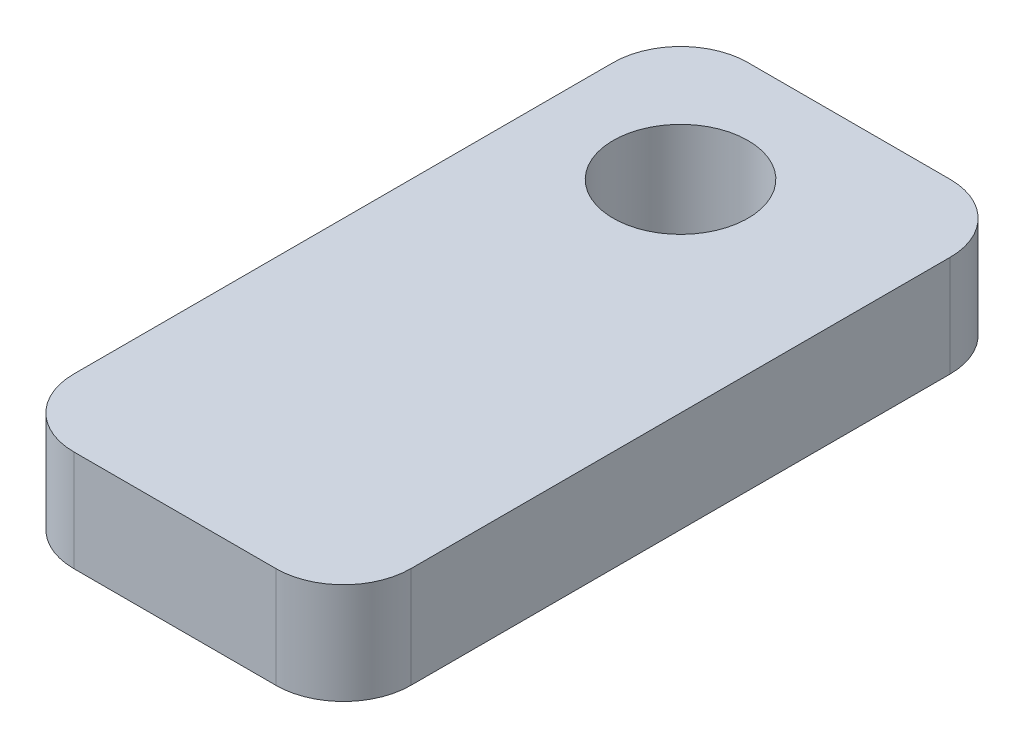
ISO-10303-21;
HEADER;
FILE_DESCRIPTION(('STEP AP214'),'2;1');
FILE_NAME('part.step','',(''),(''),'','','');
FILE_SCHEMA(('AUTOMOTIVE_DESIGN { 1 0 10303 214 1 1 1 1 }'));
ENDSEC;
DATA;
#1=APPLICATION_CONTEXT('core data for automotive mechanical design processes');
#2=APPLICATION_PROTOCOL_DEFINITION('international standard','automotive_design',2000,#1);
#3=PRODUCT_CONTEXT('',#1,'mechanical');
#4=PRODUCT('Part','Part','',(#3));
#5=PRODUCT_RELATED_PRODUCT_CATEGORY('part','',(#4));
#6=PRODUCT_DEFINITION_FORMATION('','',#4);
#7=PRODUCT_DEFINITION_CONTEXT('part definition',#1,'design');
#8=PRODUCT_DEFINITION('design','',#6,#7);
#9=PRODUCT_DEFINITION_SHAPE('','',#8);
#10=(LENGTH_UNIT() NAMED_UNIT(*) SI_UNIT(.MILLI.,.METRE.));
#11=(NAMED_UNIT(*) PLANE_ANGLE_UNIT() SI_UNIT($,.RADIAN.));
#12=(NAMED_UNIT(*) SI_UNIT($,.STERADIAN.) SOLID_ANGLE_UNIT());
#13=UNCERTAINTY_MEASURE_WITH_UNIT(LENGTH_MEASURE(1.E-05),#10,'distance_accuracy_value','');
#14=(GEOMETRIC_REPRESENTATION_CONTEXT(3) GLOBAL_UNCERTAINTY_ASSIGNED_CONTEXT((#13)) GLOBAL_UNIT_ASSIGNED_CONTEXT((#10,
#11,#12)) REPRESENTATION_CONTEXT('',''));
#15=CARTESIAN_POINT('',(0.,0.,0.));
#16=DIRECTION('',(0.,0.,1.));
#17=DIRECTION('',(1.,0.,0.));
#18=AXIS2_PLACEMENT_3D('',#15,#16,#17);
#19=CARTESIAN_POINT('',(0.,1.905,0.));
#20=DIRECTION('',(0.,1.,0.));
#21=DIRECTION('',(0.,0.,1.));
#22=AXIS2_PLACEMENT_3D('',#19,#20,#21);
#23=PLANE('',#22);
#24=DIRECTION('',(-1.,0.,0.));
#25=VECTOR('',#24,1.);
#26=CARTESIAN_POINT('',(-2.54,1.905,-2.54));
#27=LINE('',#26,#25);
#28=CARTESIAN_POINT('',(2.54,1.905,-2.54));
#29=VERTEX_POINT('',#28);
#30=CARTESIAN_POINT('',(-1.27,1.905,-2.54));
#31=VERTEX_POINT('',#30);
#32=EDGE_CURVE('E137',#29,#31,#27,.T.);
#33=ORIENTED_EDGE('',*,*,#32,.T.);
#34=CARTESIAN_POINT('',(-1.27,1.905,-1.27));
#35=DIRECTION('',(0.,1.,0.));
#36=DIRECTION('',(0.,0.,1.));
#37=AXIS2_PLACEMENT_3D('',#34,#35,#36);
#38=CIRCLE('',#37,1.27);
#39=CARTESIAN_POINT('',(-2.54,1.905,-1.27));
#40=VERTEX_POINT('',#39);
#41=EDGE_CURVE('E156',#31,#40,#38,.T.);
#42=ORIENTED_EDGE('',*,*,#41,.T.);
#43=DIRECTION('',(0.,0.,1.));
#44=VECTOR('',#43,1.);
#45=CARTESIAN_POINT('',(-2.54,1.905,-2.54));
#46=LINE('',#45,#44);
#47=CARTESIAN_POINT('',(-2.54,1.905,8.89));
#48=VERTEX_POINT('',#47);
#49=EDGE_CURVE('E120',#40,#48,#46,.T.);
#50=ORIENTED_EDGE('',*,*,#49,.T.);
#51=CARTESIAN_POINT('',(-1.27,1.905,8.89));
#52=DIRECTION('',(0.,1.,0.));
#53=DIRECTION('',(0.,0.,1.));
#54=AXIS2_PLACEMENT_3D('',#51,#52,#53);
#55=CIRCLE('',#54,1.27);
#56=CARTESIAN_POINT('',(-1.27,1.905,10.16));
#57=VERTEX_POINT('',#56);
#58=EDGE_CURVE('E151',#48,#57,#55,.T.);
#59=ORIENTED_EDGE('',*,*,#58,.T.);
#60=DIRECTION('',(1.,0.,0.));
#61=VECTOR('',#60,1.);
#62=CARTESIAN_POINT('',(-2.54,1.905,10.16));
#63=LINE('',#62,#61);
#64=CARTESIAN_POINT('',(2.54,1.905,10.16));
#65=VERTEX_POINT('',#64);
#66=EDGE_CURVE('E167',#57,#65,#63,.T.);
#67=ORIENTED_EDGE('',*,*,#66,.T.);
#68=CARTESIAN_POINT('',(2.54,1.905,8.89));
#69=DIRECTION('',(0.,1.,0.));
#70=DIRECTION('',(0.,0.,1.));
#71=AXIS2_PLACEMENT_3D('',#68,#69,#70);
#72=CIRCLE('',#71,1.27);
#73=CARTESIAN_POINT('',(3.81,1.905,8.89));
#74=VERTEX_POINT('',#73);
#75=EDGE_CURVE('E56',#65,#74,#72,.T.);
#76=ORIENTED_EDGE('',*,*,#75,.T.);
#77=DIRECTION('',(0.,0.,-1.));
#78=VECTOR('',#77,1.);
#79=CARTESIAN_POINT('',(3.81,1.905,-2.54));
#80=LINE('',#79,#78);
#81=CARTESIAN_POINT('',(3.81,1.905,-1.27));
#82=VERTEX_POINT('',#81);
#83=EDGE_CURVE('E175',#74,#82,#80,.T.);
#84=ORIENTED_EDGE('',*,*,#83,.T.);
#85=CARTESIAN_POINT('',(2.54,1.905,-1.27));
#86=DIRECTION('',(0.,1.,0.));
#87=DIRECTION('',(0.,0.,1.));
#88=AXIS2_PLACEMENT_3D('',#85,#86,#87);
#89=CIRCLE('',#88,1.27);
#90=EDGE_CURVE('E154',#82,#29,#89,.T.);
#91=ORIENTED_EDGE('',*,*,#90,.T.);
#92=EDGE_LOOP('',(#33,#42,#50,#59,#67,#76,#84,#91));
#93=FACE_BOUND('',#92,.T.);
#94=CARTESIAN_POINT('',(0.,1.905,0.));
#95=DIRECTION('',(0.,1.,0.));
#96=DIRECTION('',(0.,0.,1.));
#97=AXIS2_PLACEMENT_3D('',#94,#95,#96);
#98=CIRCLE('',#97,1.27);
#99=CARTESIAN_POINT('',(0.,1.905,-1.27));
#100=VERTEX_POINT('',#99);
#101=EDGE_CURVE('E128',#100,#100,#98,.T.);
#102=ORIENTED_EDGE('',*,*,#101,.F.);
#103=EDGE_LOOP('',(#102));
#104=FACE_BOUND('',#103,.T.);
#105=ADVANCED_FACE('F34',(#93,#104),#23,.T.);
#106=CARTESIAN_POINT('',(0.,0.,0.));
#107=DIRECTION('',(0.,1.,0.));
#108=DIRECTION('',(0.,0.,1.));
#109=AXIS2_PLACEMENT_3D('',#106,#107,#108);
#110=PLANE('',#109);
#111=DIRECTION('',(0.,0.,1.));
#112=VECTOR('',#111,1.);
#113=CARTESIAN_POINT('',(-2.54,0.,-2.54));
#114=LINE('',#113,#112);
#115=CARTESIAN_POINT('',(-2.54,0.,-1.27));
#116=VERTEX_POINT('',#115);
#117=CARTESIAN_POINT('',(-2.54,0.,8.89));
#118=VERTEX_POINT('',#117);
#119=EDGE_CURVE('E117',#116,#118,#114,.T.);
#120=ORIENTED_EDGE('',*,*,#119,.F.);
#121=CARTESIAN_POINT('',(-1.27,0.,-1.27));
#122=DIRECTION('',(0.,1.,0.));
#123=DIRECTION('',(0.,0.,1.));
#124=AXIS2_PLACEMENT_3D('',#121,#122,#123);
#125=CIRCLE('',#124,1.27);
#126=CARTESIAN_POINT('',(-1.27,0.,-2.54));
#127=VERTEX_POINT('',#126);
#128=EDGE_CURVE('E100',#116,#127,#125,.F.);
#129=ORIENTED_EDGE('',*,*,#128,.T.);
#130=DIRECTION('',(-1.,0.,0.));
#131=VECTOR('',#130,1.);
#132=CARTESIAN_POINT('',(-2.54,0.,-2.54));
#133=LINE('',#132,#131);
#134=CARTESIAN_POINT('',(2.54,0.,-2.54));
#135=VERTEX_POINT('',#134);
#136=EDGE_CURVE('E141',#135,#127,#133,.T.);
#137=ORIENTED_EDGE('',*,*,#136,.F.);
#138=CARTESIAN_POINT('',(2.54,0.,-1.27));
#139=DIRECTION('',(0.,1.,0.));
#140=DIRECTION('',(0.,0.,1.));
#141=AXIS2_PLACEMENT_3D('',#138,#139,#140);
#142=CIRCLE('',#141,1.27);
#143=CARTESIAN_POINT('',(3.81,0.,-1.27));
#144=VERTEX_POINT('',#143);
#145=EDGE_CURVE('E111',#135,#144,#142,.F.);
#146=ORIENTED_EDGE('',*,*,#145,.T.);
#147=DIRECTION('',(0.,0.,-1.));
#148=VECTOR('',#147,1.);
#149=CARTESIAN_POINT('',(3.81,0.,-2.54));
#150=LINE('',#149,#148);
#151=CARTESIAN_POINT('',(3.81,0.,8.89));
#152=VERTEX_POINT('',#151);
#153=EDGE_CURVE('E131',#152,#144,#150,.T.);
#154=ORIENTED_EDGE('',*,*,#153,.F.);
#155=CARTESIAN_POINT('',(2.54,0.,8.89));
#156=DIRECTION('',(0.,1.,0.));
#157=DIRECTION('',(0.,0.,1.));
#158=AXIS2_PLACEMENT_3D('',#155,#156,#157);
#159=CIRCLE('',#158,1.27);
#160=CARTESIAN_POINT('',(2.54,0.,10.16));
#161=VERTEX_POINT('',#160);
#162=EDGE_CURVE('E145',#152,#161,#159,.F.);
#163=ORIENTED_EDGE('',*,*,#162,.T.);
#164=DIRECTION('',(1.,0.,0.));
#165=VECTOR('',#164,1.);
#166=CARTESIAN_POINT('',(-2.54,0.,10.16));
#167=LINE('',#166,#165);
#168=CARTESIAN_POINT('',(-1.27,0.,10.16));
#169=VERTEX_POINT('',#168);
#170=EDGE_CURVE('E127',#169,#161,#167,.T.);
#171=ORIENTED_EDGE('',*,*,#170,.F.);
#172=CARTESIAN_POINT('',(-1.27,0.,8.89));
#173=DIRECTION('',(0.,1.,0.));
#174=DIRECTION('',(0.,0.,1.));
#175=AXIS2_PLACEMENT_3D('',#172,#173,#174);
#176=CIRCLE('',#175,1.27);
#177=EDGE_CURVE('E121',#169,#118,#176,.F.);
#178=ORIENTED_EDGE('',*,*,#177,.T.);
#179=EDGE_LOOP('',(#120,#129,#137,#146,#154,#163,#171,#178));
#180=FACE_BOUND('',#179,.T.);
#181=CARTESIAN_POINT('',(0.,0.,0.));
#182=DIRECTION('',(0.,1.,0.));
#183=DIRECTION('',(0.,0.,1.));
#184=AXIS2_PLACEMENT_3D('',#181,#182,#183);
#185=CIRCLE('',#184,1.27);
#186=CARTESIAN_POINT('',(0.,0.,-1.27));
#187=VERTEX_POINT('',#186);
#188=EDGE_CURVE('E134',#187,#187,#185,.T.);
#189=ORIENTED_EDGE('',*,*,#188,.T.);
#190=EDGE_LOOP('',(#189));
#191=FACE_BOUND('',#190,.T.);
#192=ADVANCED_FACE('F124',(#180,#191),#110,.F.);
#193=CARTESIAN_POINT('',(-2.54,1.905,-2.54));
#194=DIRECTION('',(1.,0.,0.));
#195=DIRECTION('',(0.,0.,-1.));
#196=AXIS2_PLACEMENT_3D('',#193,#194,#195);
#197=PLANE('',#196);
#198=ORIENTED_EDGE('',*,*,#49,.F.);
#199=DIRECTION('',(0.,-1.,0.));
#200=VECTOR('',#199,1.);
#201=CARTESIAN_POINT('',(-2.54,1.905,-1.27));
#202=LINE('',#201,#200);
#203=EDGE_CURVE('E104',#40,#116,#202,.T.);
#204=ORIENTED_EDGE('',*,*,#203,.T.);
#205=ORIENTED_EDGE('',*,*,#119,.T.);
#206=DIRECTION('',(0.,-1.,0.));
#207=VECTOR('',#206,1.);
#208=CARTESIAN_POINT('',(-2.54,1.905,8.89));
#209=LINE('',#208,#207);
#210=EDGE_CURVE('E122',#118,#48,#209,.F.);
#211=ORIENTED_EDGE('',*,*,#210,.T.);
#212=EDGE_LOOP('',(#198,#204,#205,#211));
#213=FACE_BOUND('',#212,.T.);
#214=ADVANCED_FACE('F116',(#213),#197,.F.);
#215=CARTESIAN_POINT('',(-2.54,1.905,10.16));
#216=DIRECTION('',(0.,0.,-1.));
#217=DIRECTION('',(-1.,0.,0.));
#218=AXIS2_PLACEMENT_3D('',#215,#216,#217);
#219=PLANE('',#218);
#220=ORIENTED_EDGE('',*,*,#170,.T.);
#221=DIRECTION('',(0.,-1.,0.));
#222=VECTOR('',#221,1.);
#223=CARTESIAN_POINT('',(2.54,1.905,10.16));
#224=LINE('',#223,#222);
#225=EDGE_CURVE('E11',#161,#65,#224,.F.);
#226=ORIENTED_EDGE('',*,*,#225,.T.);
#227=ORIENTED_EDGE('',*,*,#66,.F.);
#228=DIRECTION('',(0.,-1.,0.));
#229=VECTOR('',#228,1.);
#230=CARTESIAN_POINT('',(-1.27,1.905,10.16));
#231=LINE('',#230,#229);
#232=EDGE_CURVE('E42',#57,#169,#231,.T.);
#233=ORIENTED_EDGE('',*,*,#232,.T.);
#234=EDGE_LOOP('',(#220,#226,#227,#233));
#235=FACE_BOUND('',#234,.T.);
#236=ADVANCED_FACE('F165',(#235),#219,.F.);
#237=CARTESIAN_POINT('',(3.81,1.905,-2.54));
#238=DIRECTION('',(-1.,0.,0.));
#239=DIRECTION('',(0.,0.,1.));
#240=AXIS2_PLACEMENT_3D('',#237,#238,#239);
#241=PLANE('',#240);
#242=ORIENTED_EDGE('',*,*,#153,.T.);
#243=DIRECTION('',(0.,-1.,0.));
#244=VECTOR('',#243,1.);
#245=CARTESIAN_POINT('',(3.81,1.905,-1.27));
#246=LINE('',#245,#244);
#247=EDGE_CURVE('E49',#144,#82,#246,.F.);
#248=ORIENTED_EDGE('',*,*,#247,.T.);
#249=ORIENTED_EDGE('',*,*,#83,.F.);
#250=DIRECTION('',(0.,-1.,0.));
#251=VECTOR('',#250,1.);
#252=CARTESIAN_POINT('',(3.81,1.905,8.89));
#253=LINE('',#252,#251);
#254=EDGE_CURVE('E158',#74,#152,#253,.T.);
#255=ORIENTED_EDGE('',*,*,#254,.T.);
#256=EDGE_LOOP('',(#242,#248,#249,#255));
#257=FACE_BOUND('',#256,.T.);
#258=ADVANCED_FACE('F174',(#257),#241,.F.);
#259=CARTESIAN_POINT('',(-2.54,1.905,-2.54));
#260=DIRECTION('',(0.,0.,1.));
#261=DIRECTION('',(1.,0.,0.));
#262=AXIS2_PLACEMENT_3D('',#259,#260,#261);
#263=PLANE('',#262);
#264=ORIENTED_EDGE('',*,*,#136,.T.);
#265=DIRECTION('',(0.,-1.,0.));
#266=VECTOR('',#265,1.);
#267=CARTESIAN_POINT('',(-1.27,1.905,-2.54));
#268=LINE('',#267,#266);
#269=EDGE_CURVE('E105',#127,#31,#268,.F.);
#270=ORIENTED_EDGE('',*,*,#269,.T.);
#271=ORIENTED_EDGE('',*,*,#32,.F.);
#272=DIRECTION('',(0.,-1.,0.));
#273=VECTOR('',#272,1.);
#274=CARTESIAN_POINT('',(2.54,1.905,-2.54));
#275=LINE('',#274,#273);
#276=EDGE_CURVE('E110',#29,#135,#275,.T.);
#277=ORIENTED_EDGE('',*,*,#276,.T.);
#278=EDGE_LOOP('',(#264,#270,#271,#277));
#279=FACE_BOUND('',#278,.T.);
#280=ADVANCED_FACE('F186',(#279),#263,.F.);
#281=CARTESIAN_POINT('',(0.,1.905,0.));
#282=DIRECTION('',(0.,-1.,0.));
#283=DIRECTION('',(0.,0.,-1.));
#284=AXIS2_PLACEMENT_3D('',#281,#282,#283);
#285=CYLINDRICAL_SURFACE('',#284,1.27);
#286=CARTESIAN_POINT('',(0.,1.905,-1.27));
#287=CARTESIAN_POINT('',(0.,1.88515625,-1.27));
#288=CARTESIAN_POINT('',(0.,1.8653125,-1.27));
#289=CARTESIAN_POINT('',(0.,1.825625,-1.27));
#290=CARTESIAN_POINT('',(0.,1.80578125,-1.27));
#291=CARTESIAN_POINT('',(0.,1.76609375,-1.27));
#292=CARTESIAN_POINT('',(0.,1.74625,-1.27));
#293=CARTESIAN_POINT('',(0.,1.7065625,-1.27));
#294=CARTESIAN_POINT('',(0.,1.68671875,-1.27));
#295=CARTESIAN_POINT('',(0.,1.64703125,-1.27));
#296=CARTESIAN_POINT('',(0.,1.6271875,-1.27));
#297=CARTESIAN_POINT('',(0.,1.5875,-1.27));
#298=CARTESIAN_POINT('',(0.,1.56765625,-1.27));
#299=CARTESIAN_POINT('',(0.,1.52796875,-1.27));
#300=CARTESIAN_POINT('',(0.,1.508125,-1.27));
#301=CARTESIAN_POINT('',(0.,1.4684375,-1.27));
#302=CARTESIAN_POINT('',(0.,1.44859375,-1.27));
#303=CARTESIAN_POINT('',(0.,1.40890625,-1.27));
#304=CARTESIAN_POINT('',(0.,1.3890625,-1.27));
#305=CARTESIAN_POINT('',(0.,1.349375,-1.27));
#306=CARTESIAN_POINT('',(0.,1.32953125,-1.27));
#307=CARTESIAN_POINT('',(0.,1.28984375,-1.27));
#308=CARTESIAN_POINT('',(0.,1.27,-1.27));
#309=CARTESIAN_POINT('',(0.,1.2303125,-1.27));
#310=CARTESIAN_POINT('',(0.,1.21046875,-1.27));
#311=CARTESIAN_POINT('',(0.,1.17078125,-1.27));
#312=CARTESIAN_POINT('',(0.,1.1509375,-1.27));
#313=CARTESIAN_POINT('',(0.,1.11125,-1.27));
#314=CARTESIAN_POINT('',(0.,1.09140625,-1.27));
#315=CARTESIAN_POINT('',(0.,1.05171875,-1.27));
#316=CARTESIAN_POINT('',(0.,1.031875,-1.27));
#317=CARTESIAN_POINT('',(0.,0.9921875,-1.27));
#318=CARTESIAN_POINT('',(0.,0.97234375,-1.27));
#319=CARTESIAN_POINT('',(0.,0.93265625,-1.27));
#320=CARTESIAN_POINT('',(0.,0.9128125,-1.27));
#321=CARTESIAN_POINT('',(0.,0.873125,-1.27));
#322=CARTESIAN_POINT('',(0.,0.85328125,-1.27));
#323=CARTESIAN_POINT('',(0.,0.81359375,-1.27));
#324=CARTESIAN_POINT('',(0.,0.79375,-1.27));
#325=CARTESIAN_POINT('',(0.,0.7540625,-1.27));
#326=CARTESIAN_POINT('',(0.,0.73421875,-1.27));
#327=CARTESIAN_POINT('',(0.,0.69453125,-1.27));
#328=CARTESIAN_POINT('',(0.,0.6746875,-1.27));
#329=CARTESIAN_POINT('',(0.,0.635,-1.27));
#330=CARTESIAN_POINT('',(0.,0.61515625,-1.27));
#331=CARTESIAN_POINT('',(0.,0.57546875,-1.27));
#332=CARTESIAN_POINT('',(0.,0.555625,-1.27));
#333=CARTESIAN_POINT('',(0.,0.5159375,-1.27));
#334=CARTESIAN_POINT('',(0.,0.49609375,-1.27));
#335=CARTESIAN_POINT('',(0.,0.45640625,-1.27));
#336=CARTESIAN_POINT('',(0.,0.4365625,-1.27));
#337=CARTESIAN_POINT('',(0.,0.396875,-1.27));
#338=CARTESIAN_POINT('',(0.,0.37703125,-1.27));
#339=CARTESIAN_POINT('',(0.,0.33734375,-1.27));
#340=CARTESIAN_POINT('',(0.,0.3175,-1.27));
#341=CARTESIAN_POINT('',(0.,0.2778125,-1.27));
#342=CARTESIAN_POINT('',(0.,0.25796875,-1.27));
#343=CARTESIAN_POINT('',(0.,0.21828125,-1.27));
#344=CARTESIAN_POINT('',(0.,0.1984375,-1.27));
#345=CARTESIAN_POINT('',(0.,0.15875,-1.27));
#346=CARTESIAN_POINT('',(0.,0.13890625,-1.27));
#347=CARTESIAN_POINT('',(0.,0.09921875,-1.27));
#348=CARTESIAN_POINT('',(0.,0.0793749999999999,-1.27));
#349=CARTESIAN_POINT('',(0.,0.0396874999999999,-1.27));
#350=CARTESIAN_POINT('',(0.,0.01984375,-1.27));
#351=CARTESIAN_POINT('',(0.,0.,-1.27));
#352=B_SPLINE_CURVE_WITH_KNOTS('',3,(#286,#287,#288,#289,#290,#291,#292,#293,#294,#295,#296,
#297,#298,#299,#300,#301,#302,#303,#304,#305,#306,#307,#308,#309,#310,#311,#312,#313,#314,#315,
#316,#317,#318,#319,#320,#321,#322,#323,#324,#325,#326,#327,#328,#329,#330,#331,#332,#333,#334,
#335,#336,#337,#338,#339,#340,#341,#342,#343,#344,#345,#346,#347,#348,#349,#350,#351),
.UNSPECIFIED.,.F.,.F.,(4,2,2,2,2,2,2,2,2,2,2,2,2,2,2,2,2,2,2,2,2,2,2,2,2,2,2,2,2,2,2,2,4),(0.,
0.0595312500000001,0.1190625,0.17859375,0.238125,0.29765625,0.3571875,0.41671875,0.47625,
0.53578125,0.5953125,0.65484375,0.714375,0.77390625,0.8334375,0.89296875,0.9525,1.01203125,
1.0715625,1.13109375,1.190625,1.25015625,1.3096875,1.36921875,1.42875,1.48828125,1.5478125,
1.60734375,1.666875,1.72640625,1.7859375,1.84546875,1.905),.UNSPECIFIED.);
#353=EDGE_CURVE('BSEAM184',#100,#187,#352,.T.);
#354=ORIENTED_EDGE('',*,*,#101,.T.);
#355=ORIENTED_EDGE('',*,*,#188,.F.);
#356=ORIENTED_EDGE('',*,*,#353,.T.);
#357=ORIENTED_EDGE('',*,*,#353,.F.);
#358=EDGE_LOOP('',(#354,#356,#355,#357));
#359=FACE_BOUND('',#358,.T.);
#360=ADVANCED_FACE('F184',(#359),#285,.F.);
#361=CARTESIAN_POINT('',(-1.27,1.905,-1.27));
#362=DIRECTION('',(0.,-1.,0.));
#363=DIRECTION('',(0.,0.,-1.));
#364=AXIS2_PLACEMENT_3D('',#361,#362,#363);
#365=CYLINDRICAL_SURFACE('',#364,1.27);
#366=ORIENTED_EDGE('',*,*,#41,.F.);
#367=ORIENTED_EDGE('',*,*,#269,.F.);
#368=ORIENTED_EDGE('',*,*,#128,.F.);
#369=ORIENTED_EDGE('',*,*,#203,.F.);
#370=EDGE_LOOP('',(#366,#367,#368,#369));
#371=FACE_BOUND('',#370,.T.);
#372=ADVANCED_FACE('F103',(#371),#365,.T.);
#373=CARTESIAN_POINT('',(2.54,1.905,-1.27));
#374=DIRECTION('',(0.,-1.,0.));
#375=DIRECTION('',(0.,0.,-1.));
#376=AXIS2_PLACEMENT_3D('',#373,#374,#375);
#377=CYLINDRICAL_SURFACE('',#376,1.27);
#378=ORIENTED_EDGE('',*,*,#90,.F.);
#379=ORIENTED_EDGE('',*,*,#247,.F.);
#380=ORIENTED_EDGE('',*,*,#145,.F.);
#381=ORIENTED_EDGE('',*,*,#276,.F.);
#382=EDGE_LOOP('',(#378,#379,#380,#381));
#383=FACE_BOUND('',#382,.T.);
#384=ADVANCED_FACE('F193',(#383),#377,.T.);
#385=CARTESIAN_POINT('',(2.54,1.905,8.89));
#386=DIRECTION('',(0.,-1.,0.));
#387=DIRECTION('',(0.,0.,-1.));
#388=AXIS2_PLACEMENT_3D('',#385,#386,#387);
#389=CYLINDRICAL_SURFACE('',#388,1.27);
#390=ORIENTED_EDGE('',*,*,#75,.F.);
#391=ORIENTED_EDGE('',*,*,#225,.F.);
#392=ORIENTED_EDGE('',*,*,#162,.F.);
#393=ORIENTED_EDGE('',*,*,#254,.F.);
#394=EDGE_LOOP('',(#390,#391,#392,#393));
#395=FACE_BOUND('',#394,.T.);
#396=ADVANCED_FACE('F173',(#395),#389,.T.);
#397=CARTESIAN_POINT('',(-1.27,1.905,8.89));
#398=DIRECTION('',(0.,-1.,0.));
#399=DIRECTION('',(0.,0.,-1.));
#400=AXIS2_PLACEMENT_3D('',#397,#398,#399);
#401=CYLINDRICAL_SURFACE('',#400,1.27);
#402=ORIENTED_EDGE('',*,*,#58,.F.);
#403=ORIENTED_EDGE('',*,*,#210,.F.);
#404=ORIENTED_EDGE('',*,*,#177,.F.);
#405=ORIENTED_EDGE('',*,*,#232,.F.);
#406=EDGE_LOOP('',(#402,#403,#404,#405));
#407=FACE_BOUND('',#406,.T.);
#408=ADVANCED_FACE('F36',(#407),#401,.T.);
#409=CLOSED_SHELL('',(#105,#192,#214,#236,#258,#280,#360,#372,#384,#396,#408));
#410=MANIFOLD_SOLID_BREP('B2',#409);
#411=ADVANCED_BREP_SHAPE_REPRESENTATION('',(#18,#410),#14);
#412=SHAPE_DEFINITION_REPRESENTATION(#9,#411);
ENDSEC;
END-ISO-10303-21;
